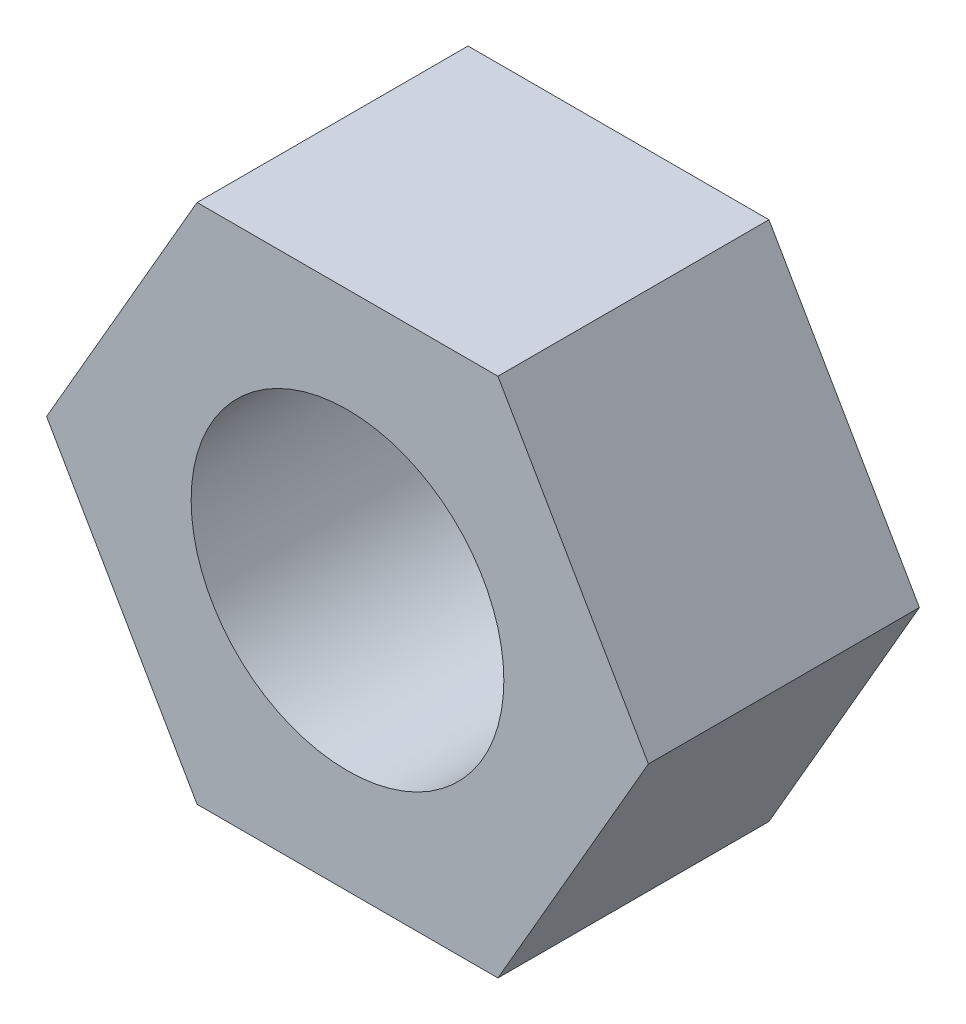
ISO-10303-21;
HEADER;
FILE_DESCRIPTION(('STEP AP214'),'2;1');
FILE_NAME('part.step','',(''),(''),'','','');
FILE_SCHEMA(('AUTOMOTIVE_DESIGN { 1 0 10303 214 1 1 1 1 }'));
ENDSEC;
DATA;
#1=APPLICATION_CONTEXT('core data for automotive mechanical design processes');
#2=APPLICATION_PROTOCOL_DEFINITION('international standard','automotive_design',2000,#1);
#3=PRODUCT_CONTEXT('',#1,'mechanical');
#4=PRODUCT('Part','Part','',(#3));
#5=PRODUCT_RELATED_PRODUCT_CATEGORY('part','',(#4));
#6=PRODUCT_DEFINITION_FORMATION('','',#4);
#7=PRODUCT_DEFINITION_CONTEXT('part definition',#1,'design');
#8=PRODUCT_DEFINITION('design','',#6,#7);
#9=PRODUCT_DEFINITION_SHAPE('','',#8);
#10=(LENGTH_UNIT() NAMED_UNIT(*) SI_UNIT(.MILLI.,.METRE.));
#11=(NAMED_UNIT(*) PLANE_ANGLE_UNIT() SI_UNIT($,.RADIAN.));
#12=(NAMED_UNIT(*) SI_UNIT($,.STERADIAN.) SOLID_ANGLE_UNIT());
#13=UNCERTAINTY_MEASURE_WITH_UNIT(LENGTH_MEASURE(1.E-05),#10,'distance_accuracy_value','');
#14=(GEOMETRIC_REPRESENTATION_CONTEXT(3) GLOBAL_UNCERTAINTY_ASSIGNED_CONTEXT((#13)) GLOBAL_UNIT_ASSIGNED_CONTEXT((#10,
#11,#12)) REPRESENTATION_CONTEXT('',''));
#15=CARTESIAN_POINT('',(0.,0.,0.));
#16=DIRECTION('',(0.,0.,1.));
#17=DIRECTION('',(1.,0.,0.));
#18=AXIS2_PLACEMENT_3D('',#15,#16,#17);
#19=CARTESIAN_POINT('',(2.88675134594813,-5.,-5.2));
#20=DIRECTION('',(0.866025403784439,-0.5,0.));
#21=DIRECTION('',(0.5,0.866025403784439,0.));
#22=AXIS2_PLACEMENT_3D('',#19,#20,#21);
#23=PLANE('',#22);
#24=DIRECTION('',(0.5,0.866025403784439,0.));
#25=VECTOR('',#24,1.);
#26=CARTESIAN_POINT('',(2.88675134594813,-5.,0.));
#27=LINE('',#26,#25);
#28=CARTESIAN_POINT('',(2.88675134594813,-5.,0.));
#29=VERTEX_POINT('',#28);
#30=CARTESIAN_POINT('',(5.77350269189626,0.,0.));
#31=VERTEX_POINT('',#30);
#32=EDGE_CURVE('E126',#29,#31,#27,.T.);
#33=ORIENTED_EDGE('',*,*,#32,.F.);
#34=DIRECTION('',(0.,0.,1.));
#35=VECTOR('',#34,1.);
#36=CARTESIAN_POINT('',(2.88675134594813,-5.,-5.2));
#37=LINE('',#36,#35);
#38=CARTESIAN_POINT('',(2.88675134594813,-5.,-5.2));
#39=VERTEX_POINT('',#38);
#40=EDGE_CURVE('E11',#39,#29,#37,.T.);
#41=ORIENTED_EDGE('',*,*,#40,.F.);
#42=DIRECTION('',(0.5,0.866025403784439,0.));
#43=VECTOR('',#42,1.);
#44=CARTESIAN_POINT('',(2.88675134594813,-5.,-5.2));
#45=LINE('',#44,#43);
#46=CARTESIAN_POINT('',(5.77350269189626,0.,-5.2));
#47=VERTEX_POINT('',#46);
#48=EDGE_CURVE('E141',#39,#47,#45,.T.);
#49=ORIENTED_EDGE('',*,*,#48,.T.);
#50=DIRECTION('',(0.,0.,1.));
#51=VECTOR('',#50,1.);
#52=CARTESIAN_POINT('',(5.77350269189626,0.,-5.2));
#53=LINE('',#52,#51);
#54=EDGE_CURVE('E44',#47,#31,#53,.T.);
#55=ORIENTED_EDGE('',*,*,#54,.T.);
#56=EDGE_LOOP('',(#33,#41,#49,#55));
#57=FACE_BOUND('',#56,.T.);
#58=ADVANCED_FACE('F41',(#57),#23,.T.);
#59=CARTESIAN_POINT('',(-2.88675134594813,-5.,-5.2));
#60=DIRECTION('',(0.,-1.,0.));
#61=DIRECTION('',(0.,0.,-1.));
#62=AXIS2_PLACEMENT_3D('',#59,#60,#61);
#63=PLANE('',#62);
#64=DIRECTION('',(1.,0.,0.));
#65=VECTOR('',#64,1.);
#66=CARTESIAN_POINT('',(-2.88675134594813,-5.,0.));
#67=LINE('',#66,#65);
#68=CARTESIAN_POINT('',(-2.88675134594813,-5.,0.));
#69=VERTEX_POINT('',#68);
#70=EDGE_CURVE('E139',#69,#29,#67,.T.);
#71=ORIENTED_EDGE('',*,*,#70,.F.);
#72=DIRECTION('',(0.,0.,1.));
#73=VECTOR('',#72,1.);
#74=CARTESIAN_POINT('',(-2.88675134594813,-5.,-5.2));
#75=LINE('',#74,#73);
#76=CARTESIAN_POINT('',(-2.88675134594813,-5.,-5.2));
#77=VERTEX_POINT('',#76);
#78=EDGE_CURVE('E50',#77,#69,#75,.T.);
#79=ORIENTED_EDGE('',*,*,#78,.F.);
#80=DIRECTION('',(1.,0.,0.));
#81=VECTOR('',#80,1.);
#82=CARTESIAN_POINT('',(-2.88675134594813,-5.,-5.2));
#83=LINE('',#82,#81);
#84=EDGE_CURVE('E116',#77,#39,#83,.T.);
#85=ORIENTED_EDGE('',*,*,#84,.T.);
#86=ORIENTED_EDGE('',*,*,#40,.T.);
#87=EDGE_LOOP('',(#71,#79,#85,#86));
#88=FACE_BOUND('',#87,.T.);
#89=ADVANCED_FACE('F149',(#88),#63,.T.);
#90=CARTESIAN_POINT('',(-5.77350269189626,0.,-5.2));
#91=DIRECTION('',(-0.866025403784439,-0.5,0.));
#92=DIRECTION('',(0.5,-0.866025403784439,0.));
#93=AXIS2_PLACEMENT_3D('',#90,#91,#92);
#94=PLANE('',#93);
#95=DIRECTION('',(0.5,-0.866025403784439,0.));
#96=VECTOR('',#95,1.);
#97=CARTESIAN_POINT('',(-5.77350269189626,0.,0.));
#98=LINE('',#97,#96);
#99=CARTESIAN_POINT('',(-5.77350269189626,0.,0.));
#100=VERTEX_POINT('',#99);
#101=EDGE_CURVE('E103',#100,#69,#98,.T.);
#102=ORIENTED_EDGE('',*,*,#101,.F.);
#103=DIRECTION('',(0.,0.,1.));
#104=VECTOR('',#103,1.);
#105=CARTESIAN_POINT('',(-5.77350269189626,0.,-5.2));
#106=LINE('',#105,#104);
#107=CARTESIAN_POINT('',(-5.77350269189626,0.,-5.2));
#108=VERTEX_POINT('',#107);
#109=EDGE_CURVE('E98',#108,#100,#106,.T.);
#110=ORIENTED_EDGE('',*,*,#109,.F.);
#111=DIRECTION('',(0.5,-0.866025403784439,0.));
#112=VECTOR('',#111,1.);
#113=CARTESIAN_POINT('',(-5.77350269189626,0.,-5.2));
#114=LINE('',#113,#112);
#115=EDGE_CURVE('E101',#108,#77,#114,.T.);
#116=ORIENTED_EDGE('',*,*,#115,.T.);
#117=ORIENTED_EDGE('',*,*,#78,.T.);
#118=EDGE_LOOP('',(#102,#110,#116,#117));
#119=FACE_BOUND('',#118,.T.);
#120=ADVANCED_FACE('F100',(#119),#94,.T.);
#121=CARTESIAN_POINT('',(-2.88675134594813,5.,-5.2));
#122=DIRECTION('',(-0.866025403784439,0.5,0.));
#123=DIRECTION('',(-0.5,-0.866025403784439,0.));
#124=AXIS2_PLACEMENT_3D('',#121,#122,#123);
#125=PLANE('',#124);
#126=DIRECTION('',(-0.5,-0.866025403784439,0.));
#127=VECTOR('',#126,1.);
#128=CARTESIAN_POINT('',(-2.88675134594813,5.,0.));
#129=LINE('',#128,#127);
#130=CARTESIAN_POINT('',(-2.88675134594813,5.,0.));
#131=VERTEX_POINT('',#130);
#132=EDGE_CURVE('E136',#131,#100,#129,.T.);
#133=ORIENTED_EDGE('',*,*,#132,.F.);
#134=DIRECTION('',(0.,0.,1.));
#135=VECTOR('',#134,1.);
#136=CARTESIAN_POINT('',(-2.88675134594813,5.,-5.2));
#137=LINE('',#136,#135);
#138=CARTESIAN_POINT('',(-2.88675134594813,5.,-5.2));
#139=VERTEX_POINT('',#138);
#140=EDGE_CURVE('E108',#139,#131,#137,.T.);
#141=ORIENTED_EDGE('',*,*,#140,.F.);
#142=DIRECTION('',(-0.5,-0.866025403784439,0.));
#143=VECTOR('',#142,1.);
#144=CARTESIAN_POINT('',(-2.88675134594813,5.,-5.2));
#145=LINE('',#144,#143);
#146=EDGE_CURVE('E114',#139,#108,#145,.T.);
#147=ORIENTED_EDGE('',*,*,#146,.T.);
#148=ORIENTED_EDGE('',*,*,#109,.T.);
#149=EDGE_LOOP('',(#133,#141,#147,#148));
#150=FACE_BOUND('',#149,.T.);
#151=ADVANCED_FACE('F118',(#150),#125,.T.);
#152=CARTESIAN_POINT('',(2.88675134594813,5.,-5.2));
#153=DIRECTION('',(0.,1.,0.));
#154=DIRECTION('',(-1.,0.,0.));
#155=AXIS2_PLACEMENT_3D('',#152,#153,#154);
#156=PLANE('',#155);
#157=DIRECTION('',(-1.,0.,0.));
#158=VECTOR('',#157,1.);
#159=CARTESIAN_POINT('',(2.88675134594813,5.,0.));
#160=LINE('',#159,#158);
#161=CARTESIAN_POINT('',(2.88675134594813,5.,0.));
#162=VERTEX_POINT('',#161);
#163=EDGE_CURVE('E133',#162,#131,#160,.T.);
#164=ORIENTED_EDGE('',*,*,#163,.F.);
#165=DIRECTION('',(0.,0.,1.));
#166=VECTOR('',#165,1.);
#167=CARTESIAN_POINT('',(2.88675134594813,5.,-5.2));
#168=LINE('',#167,#166);
#169=CARTESIAN_POINT('',(2.88675134594813,5.,-5.2));
#170=VERTEX_POINT('',#169);
#171=EDGE_CURVE('E144',#170,#162,#168,.T.);
#172=ORIENTED_EDGE('',*,*,#171,.F.);
#173=DIRECTION('',(-1.,0.,0.));
#174=VECTOR('',#173,1.);
#175=CARTESIAN_POINT('',(2.88675134594813,5.,-5.2));
#176=LINE('',#175,#174);
#177=EDGE_CURVE('E119',#170,#139,#176,.T.);
#178=ORIENTED_EDGE('',*,*,#177,.T.);
#179=ORIENTED_EDGE('',*,*,#140,.T.);
#180=EDGE_LOOP('',(#164,#172,#178,#179));
#181=FACE_BOUND('',#180,.T.);
#182=ADVANCED_FACE('F162',(#181),#156,.T.);
#183=CARTESIAN_POINT('',(5.77350269189626,0.,-5.2));
#184=DIRECTION('',(0.866025403784439,0.5,0.));
#185=DIRECTION('',(-0.5,0.866025403784439,0.));
#186=AXIS2_PLACEMENT_3D('',#183,#184,#185);
#187=PLANE('',#186);
#188=DIRECTION('',(-0.5,0.866025403784439,0.));
#189=VECTOR('',#188,1.);
#190=CARTESIAN_POINT('',(5.77350269189626,0.,0.));
#191=LINE('',#190,#189);
#192=EDGE_CURVE('E129',#31,#162,#191,.T.);
#193=ORIENTED_EDGE('',*,*,#192,.F.);
#194=ORIENTED_EDGE('',*,*,#54,.F.);
#195=DIRECTION('',(-0.5,0.866025403784439,0.));
#196=VECTOR('',#195,1.);
#197=CARTESIAN_POINT('',(5.77350269189626,0.,-5.2));
#198=LINE('',#197,#196);
#199=EDGE_CURVE('E121',#47,#170,#198,.T.);
#200=ORIENTED_EDGE('',*,*,#199,.T.);
#201=ORIENTED_EDGE('',*,*,#171,.T.);
#202=EDGE_LOOP('',(#193,#194,#200,#201));
#203=FACE_BOUND('',#202,.T.);
#204=ADVANCED_FACE('F146',(#203),#187,.T.);
#205=CARTESIAN_POINT('',(0.,0.,-5.2));
#206=DIRECTION('',(0.,0.,1.));
#207=DIRECTION('',(1.,0.,0.));
#208=AXIS2_PLACEMENT_3D('',#205,#206,#207);
#209=PLANE('',#208);
#210=CARTESIAN_POINT('',(0.,0.,-5.2));
#211=DIRECTION('',(0.,0.,1.));
#212=DIRECTION('',(1.,0.,0.));
#213=AXIS2_PLACEMENT_3D('',#210,#211,#212);
#214=CIRCLE('',#213,3.);
#215=CARTESIAN_POINT('',(3.,0.,-5.2));
#216=VERTEX_POINT('',#215);
#217=EDGE_CURVE('E130',#216,#216,#214,.T.);
#218=ORIENTED_EDGE('',*,*,#217,.T.);
#219=EDGE_LOOP('',(#218));
#220=FACE_BOUND('',#219,.T.);
#221=ORIENTED_EDGE('',*,*,#48,.F.);
#222=ORIENTED_EDGE('',*,*,#84,.F.);
#223=ORIENTED_EDGE('',*,*,#115,.F.);
#224=ORIENTED_EDGE('',*,*,#146,.F.);
#225=ORIENTED_EDGE('',*,*,#177,.F.);
#226=ORIENTED_EDGE('',*,*,#199,.F.);
#227=EDGE_LOOP('',(#221,#222,#223,#224,#225,#226));
#228=FACE_BOUND('',#227,.T.);
#229=ADVANCED_FACE('F112',(#220,#228),#209,.F.);
#230=CARTESIAN_POINT('',(0.,0.,0.));
#231=DIRECTION('',(0.,0.,1.));
#232=DIRECTION('',(1.,0.,0.));
#233=AXIS2_PLACEMENT_3D('',#230,#231,#232);
#234=PLANE('',#233);
#235=CARTESIAN_POINT('',(0.,0.,0.));
#236=DIRECTION('',(0.,0.,1.));
#237=DIRECTION('',(1.,0.,0.));
#238=AXIS2_PLACEMENT_3D('',#235,#236,#237);
#239=CIRCLE('',#238,3.);
#240=CARTESIAN_POINT('',(3.,0.,0.));
#241=VERTEX_POINT('',#240);
#242=EDGE_CURVE('E185',#241,#241,#239,.T.);
#243=ORIENTED_EDGE('',*,*,#242,.F.);
#244=EDGE_LOOP('',(#243));
#245=FACE_BOUND('',#244,.T.);
#246=ORIENTED_EDGE('',*,*,#32,.T.);
#247=ORIENTED_EDGE('',*,*,#192,.T.);
#248=ORIENTED_EDGE('',*,*,#163,.T.);
#249=ORIENTED_EDGE('',*,*,#132,.T.);
#250=ORIENTED_EDGE('',*,*,#101,.T.);
#251=ORIENTED_EDGE('',*,*,#70,.T.);
#252=EDGE_LOOP('',(#246,#247,#248,#249,#250,#251));
#253=FACE_BOUND('',#252,.T.);
#254=ADVANCED_FACE('F148',(#245,#253),#234,.T.);
#255=CARTESIAN_POINT('',(0.,0.,-5.2));
#256=DIRECTION('',(0.,0.,1.));
#257=DIRECTION('',(1.,0.,0.));
#258=AXIS2_PLACEMENT_3D('',#255,#256,#257);
#259=CYLINDRICAL_SURFACE('',#258,3.);
#260=ORIENTED_EDGE('',*,*,#217,.F.);
#261=EDGE_LOOP('',(#260));
#262=FACE_BOUND('',#261,.T.);
#263=ORIENTED_EDGE('',*,*,#242,.T.);
#264=EDGE_LOOP('',(#263));
#265=FACE_BOUND('',#264,.T.);
#266=ADVANCED_FACE('F173',(#262,#265),#259,.F.);
#267=CLOSED_SHELL('',(#58,#89,#120,#151,#182,#204,#229,#254,#266));
#268=MANIFOLD_SOLID_BREP('B2',#267);
#269=ADVANCED_BREP_SHAPE_REPRESENTATION('',(#18,#268),#14);
#270=SHAPE_DEFINITION_REPRESENTATION(#9,#269);
ENDSEC;
END-ISO-10303-21;
